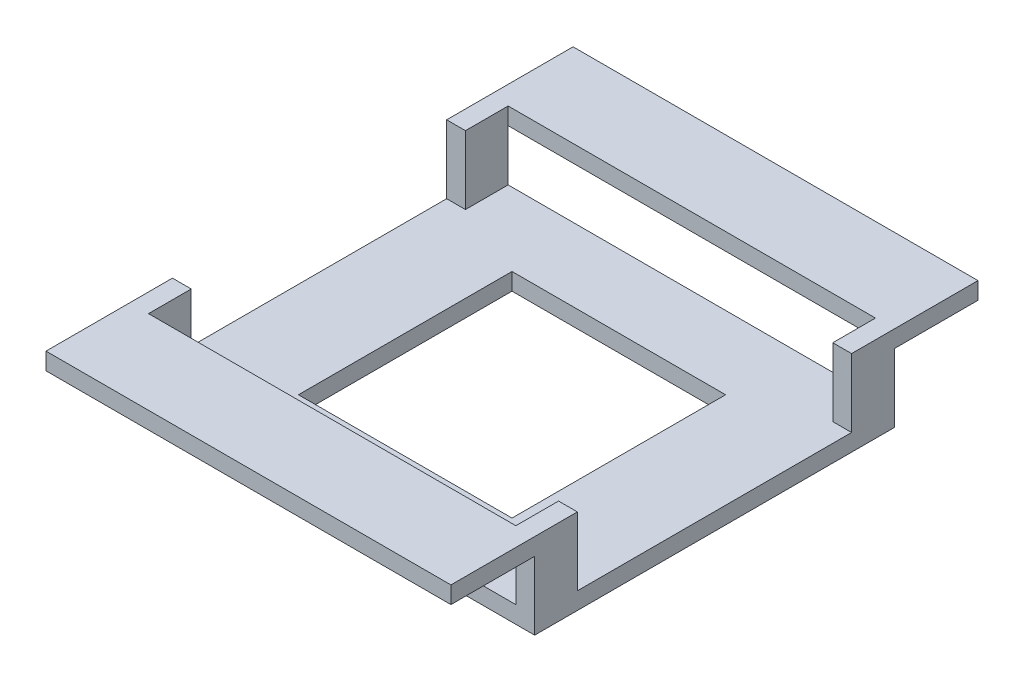
ISO-10303-21;
HEADER;
FILE_DESCRIPTION(('STEP AP214'),'2;1');
FILE_NAME('part.step','',(''),(''),'','','');
FILE_SCHEMA(('AUTOMOTIVE_DESIGN { 1 0 10303 214 1 1 1 1 }'));
ENDSEC;
DATA;
#1=APPLICATION_CONTEXT('core data for automotive mechanical design processes');
#2=APPLICATION_PROTOCOL_DEFINITION('international standard','automotive_design',2000,#1);
#3=PRODUCT_CONTEXT('',#1,'mechanical');
#4=PRODUCT('Part','Part','',(#3));
#5=PRODUCT_RELATED_PRODUCT_CATEGORY('part','',(#4));
#6=PRODUCT_DEFINITION_FORMATION('','',#4);
#7=PRODUCT_DEFINITION_CONTEXT('part definition',#1,'design');
#8=PRODUCT_DEFINITION('design','',#6,#7);
#9=PRODUCT_DEFINITION_SHAPE('','',#8);
#10=(LENGTH_UNIT() NAMED_UNIT(*) SI_UNIT(.MILLI.,.METRE.));
#11=(NAMED_UNIT(*) PLANE_ANGLE_UNIT() SI_UNIT($,.RADIAN.));
#12=(NAMED_UNIT(*) SI_UNIT($,.STERADIAN.) SOLID_ANGLE_UNIT());
#13=UNCERTAINTY_MEASURE_WITH_UNIT(LENGTH_MEASURE(1.E-05),#10,'distance_accuracy_value','');
#14=(GEOMETRIC_REPRESENTATION_CONTEXT(3) GLOBAL_UNCERTAINTY_ASSIGNED_CONTEXT((#13)) GLOBAL_UNIT_ASSIGNED_CONTEXT((#10,
#11,#12)) REPRESENTATION_CONTEXT('',''));
#15=CARTESIAN_POINT('',(0.,0.,0.));
#16=DIRECTION('',(0.,0.,1.));
#17=DIRECTION('',(1.,0.,0.));
#18=AXIS2_PLACEMENT_3D('',#15,#16,#17);
#19=CARTESIAN_POINT('',(-23.7,2.,21.05));
#20=DIRECTION('',(0.,0.,-1.));
#21=DIRECTION('',(-1.,0.,0.));
#22=AXIS2_PLACEMENT_3D('',#19,#20,#21);
#23=PLANE('',#22);
#24=DIRECTION('',(1.,0.,0.));
#25=VECTOR('',#24,1.);
#26=CARTESIAN_POINT('',(21.5,8.,21.05));
#27=LINE('',#26,#25);
#28=CARTESIAN_POINT('',(21.5,8.,21.05));
#29=VERTEX_POINT('',#28);
#30=CARTESIAN_POINT('',(23.7,8.,21.05));
#31=VERTEX_POINT('',#30);
#32=EDGE_CURVE('E271',#29,#31,#27,.T.);
#33=ORIENTED_EDGE('',*,*,#32,.F.);
#34=DIRECTION('',(0.,-1.,0.));
#35=VECTOR('',#34,1.);
#36=CARTESIAN_POINT('',(21.5,10.,21.05));
#37=LINE('',#36,#35);
#38=CARTESIAN_POINT('',(21.5,2.,21.05));
#39=VERTEX_POINT('',#38);
#40=EDGE_CURVE('E305',#29,#39,#37,.T.);
#41=ORIENTED_EDGE('',*,*,#40,.T.);
#42=DIRECTION('',(1.,0.,0.));
#43=VECTOR('',#42,1.);
#44=CARTESIAN_POINT('',(-23.7,2.,21.05));
#45=LINE('',#44,#43);
#46=CARTESIAN_POINT('',(-21.5,2.,21.05));
#47=VERTEX_POINT('',#46);
#48=EDGE_CURVE('E483',#47,#39,#45,.T.);
#49=ORIENTED_EDGE('',*,*,#48,.F.);
#50=DIRECTION('',(0.,-1.,0.));
#51=VECTOR('',#50,1.);
#52=CARTESIAN_POINT('',(-21.5,10.,21.05));
#53=LINE('',#52,#51);
#54=CARTESIAN_POINT('',(-21.5,8.,21.05));
#55=VERTEX_POINT('',#54);
#56=EDGE_CURVE('E366',#55,#47,#53,.T.);
#57=ORIENTED_EDGE('',*,*,#56,.F.);
#58=DIRECTION('',(-1.,0.,0.));
#59=VECTOR('',#58,1.);
#60=CARTESIAN_POINT('',(-21.5,8.,21.05));
#61=LINE('',#60,#59);
#62=CARTESIAN_POINT('',(-23.7,8.,21.05));
#63=VERTEX_POINT('',#62);
#64=EDGE_CURVE('E322',#55,#63,#61,.T.);
#65=ORIENTED_EDGE('',*,*,#64,.T.);
#66=DIRECTION('',(0.,-1.,0.));
#67=VECTOR('',#66,1.);
#68=CARTESIAN_POINT('',(-23.7,2.,21.05));
#69=LINE('',#68,#67);
#70=CARTESIAN_POINT('',(-23.7,0.,21.05));
#71=VERTEX_POINT('',#70);
#72=EDGE_CURVE('E504',#63,#71,#69,.T.);
#73=ORIENTED_EDGE('',*,*,#72,.T.);
#74=DIRECTION('',(1.,0.,0.));
#75=VECTOR('',#74,1.);
#76=CARTESIAN_POINT('',(-23.7,0.,21.05));
#77=LINE('',#76,#75);
#78=CARTESIAN_POINT('',(23.7,0.,21.05));
#79=VERTEX_POINT('',#78);
#80=EDGE_CURVE('E477',#71,#79,#77,.T.);
#81=ORIENTED_EDGE('',*,*,#80,.T.);
#82=DIRECTION('',(0.,-1.,0.));
#83=VECTOR('',#82,1.);
#84=CARTESIAN_POINT('',(23.7,2.,21.05));
#85=LINE('',#84,#83);
#86=EDGE_CURVE('E487',#31,#79,#85,.T.);
#87=ORIENTED_EDGE('',*,*,#86,.F.);
#88=EDGE_LOOP('',(#33,#41,#49,#57,#65,#73,#81,#87));
#89=FACE_BOUND('',#88,.T.);
#90=ADVANCED_FACE('F45',(#89),#23,.F.);
#91=CARTESIAN_POINT('',(0.,2.,0.));
#92=DIRECTION('',(0.,-1.,0.));
#93=DIRECTION('',(0.,0.,-1.));
#94=AXIS2_PLACEMENT_3D('',#91,#92,#93);
#95=PLANE('',#94);
#96=DIRECTION('',(1.,0.,0.));
#97=VECTOR('',#96,1.);
#98=CARTESIAN_POINT('',(-12.5,2.,-12.5));
#99=LINE('',#98,#97);
#100=CARTESIAN_POINT('',(-12.5,2.,-12.5));
#101=VERTEX_POINT('',#100);
#102=CARTESIAN_POINT('',(12.5,2.,-12.5));
#103=VERTEX_POINT('',#102);
#104=EDGE_CURVE('E227',#101,#103,#99,.T.);
#105=ORIENTED_EDGE('',*,*,#104,.T.);
#106=DIRECTION('',(0.,0.,1.));
#107=VECTOR('',#106,1.);
#108=CARTESIAN_POINT('',(12.5,2.,12.5));
#109=LINE('',#108,#107);
#110=CARTESIAN_POINT('',(12.5,2.,12.5));
#111=VERTEX_POINT('',#110);
#112=EDGE_CURVE('E220',#103,#111,#109,.T.);
#113=ORIENTED_EDGE('',*,*,#112,.T.);
#114=DIRECTION('',(-1.,0.,0.));
#115=VECTOR('',#114,1.);
#116=CARTESIAN_POINT('',(-12.5,2.,12.5));
#117=LINE('',#116,#115);
#118=CARTESIAN_POINT('',(-12.5,2.,12.5));
#119=VERTEX_POINT('',#118);
#120=EDGE_CURVE('E230',#111,#119,#117,.T.);
#121=ORIENTED_EDGE('',*,*,#120,.T.);
#122=DIRECTION('',(0.,0.,-1.));
#123=VECTOR('',#122,1.);
#124=CARTESIAN_POINT('',(-12.5,2.,12.5));
#125=LINE('',#124,#123);
#126=EDGE_CURVE('E61',#119,#101,#125,.T.);
#127=ORIENTED_EDGE('',*,*,#126,.T.);
#128=EDGE_LOOP('',(#105,#113,#121,#127));
#129=FACE_BOUND('',#128,.T.);
#130=DIRECTION('',(-1.,0.,0.));
#131=VECTOR('',#130,1.);
#132=CARTESIAN_POINT('',(23.7,2.,16.05));
#133=LINE('',#132,#131);
#134=CARTESIAN_POINT('',(23.7,2.,16.05));
#135=VERTEX_POINT('',#134);
#136=CARTESIAN_POINT('',(21.5,2.,16.05));
#137=VERTEX_POINT('',#136);
#138=EDGE_CURVE('E292',#135,#137,#133,.T.);
#139=ORIENTED_EDGE('',*,*,#138,.F.);
#140=DIRECTION('',(0.,0.,-1.));
#141=VECTOR('',#140,1.);
#142=CARTESIAN_POINT('',(23.7,2.,21.05));
#143=LINE('',#142,#141);
#144=CARTESIAN_POINT('',(23.7,2.,-16.05));
#145=VERTEX_POINT('',#144);
#146=EDGE_CURVE('E473',#135,#145,#143,.T.);
#147=ORIENTED_EDGE('',*,*,#146,.T.);
#148=DIRECTION('',(-1.,0.,0.));
#149=VECTOR('',#148,1.);
#150=CARTESIAN_POINT('',(23.7,2.,-16.05));
#151=LINE('',#150,#149);
#152=CARTESIAN_POINT('',(21.5,2.,-16.05));
#153=VERTEX_POINT('',#152);
#154=EDGE_CURVE('E400',#145,#153,#151,.T.);
#155=ORIENTED_EDGE('',*,*,#154,.T.);
#156=DIRECTION('',(0.,0.,-1.));
#157=VECTOR('',#156,1.);
#158=CARTESIAN_POINT('',(21.5,2.,-21.05));
#159=LINE('',#158,#157);
#160=CARTESIAN_POINT('',(21.5,2.,-21.05));
#161=VERTEX_POINT('',#160);
#162=EDGE_CURVE('E394',#153,#161,#159,.T.);
#163=ORIENTED_EDGE('',*,*,#162,.T.);
#164=DIRECTION('',(-1.,0.,0.));
#165=VECTOR('',#164,1.);
#166=CARTESIAN_POINT('',(-23.7,2.,-21.05));
#167=LINE('',#166,#165);
#168=CARTESIAN_POINT('',(-21.5,2.,-21.05));
#169=VERTEX_POINT('',#168);
#170=EDGE_CURVE('E476',#161,#169,#167,.T.);
#171=ORIENTED_EDGE('',*,*,#170,.T.);
#172=DIRECTION('',(0.,0.,-1.));
#173=VECTOR('',#172,1.);
#174=CARTESIAN_POINT('',(-21.5,2.,-21.05));
#175=LINE('',#174,#173);
#176=CARTESIAN_POINT('',(-21.5,2.,-16.05));
#177=VERTEX_POINT('',#176);
#178=EDGE_CURVE('E447',#177,#169,#175,.T.);
#179=ORIENTED_EDGE('',*,*,#178,.F.);
#180=DIRECTION('',(1.,0.,0.));
#181=VECTOR('',#180,1.);
#182=CARTESIAN_POINT('',(-23.7,2.,-16.05));
#183=LINE('',#182,#181);
#184=CARTESIAN_POINT('',(-23.7,2.,-16.05));
#185=VERTEX_POINT('',#184);
#186=EDGE_CURVE('E441',#185,#177,#183,.T.);
#187=ORIENTED_EDGE('',*,*,#186,.F.);
#188=DIRECTION('',(0.,0.,1.));
#189=VECTOR('',#188,1.);
#190=CARTESIAN_POINT('',(-23.7,2.,21.05));
#191=LINE('',#190,#189);
#192=CARTESIAN_POINT('',(-23.7,2.,16.05));
#193=VERTEX_POINT('',#192);
#194=EDGE_CURVE('E480',#185,#193,#191,.T.);
#195=ORIENTED_EDGE('',*,*,#194,.T.);
#196=DIRECTION('',(1.,0.,0.));
#197=VECTOR('',#196,1.);
#198=CARTESIAN_POINT('',(-23.7,2.,16.05));
#199=LINE('',#198,#197);
#200=CARTESIAN_POINT('',(-21.5,2.,16.05));
#201=VERTEX_POINT('',#200);
#202=EDGE_CURVE('E346',#193,#201,#199,.T.);
#203=ORIENTED_EDGE('',*,*,#202,.T.);
#204=DIRECTION('',(0.,0.,1.));
#205=VECTOR('',#204,1.);
#206=CARTESIAN_POINT('',(-21.5,2.,21.05));
#207=LINE('',#206,#205);
#208=EDGE_CURVE('E340',#201,#47,#207,.T.);
#209=ORIENTED_EDGE('',*,*,#208,.T.);
#210=ORIENTED_EDGE('',*,*,#48,.T.);
#211=DIRECTION('',(0.,0.,1.));
#212=VECTOR('',#211,1.);
#213=CARTESIAN_POINT('',(21.5,2.,21.05));
#214=LINE('',#213,#212);
#215=EDGE_CURVE('E298',#137,#39,#214,.T.);
#216=ORIENTED_EDGE('',*,*,#215,.F.);
#217=EDGE_LOOP('',(#139,#147,#155,#163,#171,#179,#187,#195,#203,#209,#210,#216));
#218=FACE_BOUND('',#217,.T.);
#219=ADVANCED_FACE('F235',(#129,#218),#95,.F.);
#220=CARTESIAN_POINT('',(-21.5,10.,-21.05));
#221=DIRECTION('',(-1.,0.,0.));
#222=DIRECTION('',(0.,0.,1.));
#223=AXIS2_PLACEMENT_3D('',#220,#221,#222);
#224=PLANE('',#223);
#225=DIRECTION('',(0.,-1.,0.));
#226=VECTOR('',#225,1.);
#227=CARTESIAN_POINT('',(-21.5,8.,-21.05));
#228=LINE('',#227,#226);
#229=CARTESIAN_POINT('',(-21.5,10.,-21.05));
#230=VERTEX_POINT('',#229);
#231=CARTESIAN_POINT('',(-21.5,8.,-21.05));
#232=VERTEX_POINT('',#231);
#233=EDGE_CURVE('E369',#230,#232,#228,.T.);
#234=ORIENTED_EDGE('',*,*,#233,.F.);
#235=DIRECTION('',(0.,0.,-1.));
#236=VECTOR('',#235,1.);
#237=CARTESIAN_POINT('',(-21.5,10.,-21.05));
#238=LINE('',#237,#236);
#239=CARTESIAN_POINT('',(-21.5,10.,-16.05));
#240=VERTEX_POINT('',#239);
#241=EDGE_CURVE('E450',#240,#230,#238,.T.);
#242=ORIENTED_EDGE('',*,*,#241,.F.);
#243=DIRECTION('',(0.,-1.,0.));
#244=VECTOR('',#243,1.);
#245=CARTESIAN_POINT('',(-21.5,10.,-16.05));
#246=LINE('',#245,#244);
#247=EDGE_CURVE('E464',#240,#177,#246,.T.);
#248=ORIENTED_EDGE('',*,*,#247,.T.);
#249=ORIENTED_EDGE('',*,*,#178,.T.);
#250=DIRECTION('',(0.,-1.,0.));
#251=VECTOR('',#250,1.);
#252=CARTESIAN_POINT('',(-21.5,10.,-21.05));
#253=LINE('',#252,#251);
#254=EDGE_CURVE('E454',#232,#169,#253,.T.);
#255=ORIENTED_EDGE('',*,*,#254,.F.);
#256=EDGE_LOOP('',(#234,#242,#248,#249,#255));
#257=FACE_BOUND('',#256,.T.);
#258=ADVANCED_FACE('F558',(#257),#224,.F.);
#259=CARTESIAN_POINT('',(21.5,10.,-21.05));
#260=DIRECTION('',(-1.,0.,0.));
#261=DIRECTION('',(0.,0.,1.));
#262=AXIS2_PLACEMENT_3D('',#259,#260,#261);
#263=PLANE('',#262);
#264=DIRECTION('',(0.,0.,-1.));
#265=VECTOR('',#264,1.);
#266=CARTESIAN_POINT('',(21.5,10.,-21.05));
#267=LINE('',#266,#265);
#268=CARTESIAN_POINT('',(21.5,10.,-16.05));
#269=VERTEX_POINT('',#268);
#270=CARTESIAN_POINT('',(21.5,10.,-21.05));
#271=VERTEX_POINT('',#270);
#272=EDGE_CURVE('E399',#269,#271,#267,.T.);
#273=ORIENTED_EDGE('',*,*,#272,.T.);
#274=DIRECTION('',(0.,1.,0.));
#275=VECTOR('',#274,1.);
#276=CARTESIAN_POINT('',(21.5,8.,-21.05));
#277=LINE('',#276,#275);
#278=CARTESIAN_POINT('',(21.5,8.,-21.05));
#279=VERTEX_POINT('',#278);
#280=EDGE_CURVE('E370',#279,#271,#277,.T.);
#281=ORIENTED_EDGE('',*,*,#280,.F.);
#282=DIRECTION('',(0.,-1.,0.));
#283=VECTOR('',#282,1.);
#284=CARTESIAN_POINT('',(21.5,10.,-21.05));
#285=LINE('',#284,#283);
#286=EDGE_CURVE('E420',#279,#161,#285,.T.);
#287=ORIENTED_EDGE('',*,*,#286,.T.);
#288=ORIENTED_EDGE('',*,*,#162,.F.);
#289=DIRECTION('',(0.,-1.,0.));
#290=VECTOR('',#289,1.);
#291=CARTESIAN_POINT('',(21.5,10.,-16.05));
#292=LINE('',#291,#290);
#293=EDGE_CURVE('E416',#269,#153,#292,.T.);
#294=ORIENTED_EDGE('',*,*,#293,.F.);
#295=EDGE_LOOP('',(#273,#281,#287,#288,#294));
#296=FACE_BOUND('',#295,.T.);
#297=ADVANCED_FACE('F578',(#296),#263,.T.);
#298=CARTESIAN_POINT('',(-23.7,2.,-21.05));
#299=DIRECTION('',(0.,0.,1.));
#300=DIRECTION('',(1.,0.,0.));
#301=AXIS2_PLACEMENT_3D('',#298,#299,#300);
#302=PLANE('',#301);
#303=ORIENTED_EDGE('',*,*,#286,.F.);
#304=DIRECTION('',(1.,0.,0.));
#305=VECTOR('',#304,1.);
#306=CARTESIAN_POINT('',(21.5,8.,-21.05));
#307=LINE('',#306,#305);
#308=CARTESIAN_POINT('',(23.7,8.,-21.05));
#309=VERTEX_POINT('',#308);
#310=EDGE_CURVE('E374',#279,#309,#307,.T.);
#311=ORIENTED_EDGE('',*,*,#310,.T.);
#312=DIRECTION('',(0.,-1.,0.));
#313=VECTOR('',#312,1.);
#314=CARTESIAN_POINT('',(23.7,2.,-21.05));
#315=LINE('',#314,#313);
#316=CARTESIAN_POINT('',(23.7,0.,-21.05));
#317=VERTEX_POINT('',#316);
#318=EDGE_CURVE('E11',#309,#317,#315,.T.);
#319=ORIENTED_EDGE('',*,*,#318,.T.);
#320=DIRECTION('',(-1.,0.,0.));
#321=VECTOR('',#320,1.);
#322=CARTESIAN_POINT('',(-23.7,0.,-21.05));
#323=LINE('',#322,#321);
#324=CARTESIAN_POINT('',(-23.7,0.,-21.05));
#325=VERTEX_POINT('',#324);
#326=EDGE_CURVE('E491',#317,#325,#323,.T.);
#327=ORIENTED_EDGE('',*,*,#326,.T.);
#328=DIRECTION('',(0.,-1.,0.));
#329=VECTOR('',#328,1.);
#330=CARTESIAN_POINT('',(-23.7,2.,-21.05));
#331=LINE('',#330,#329);
#332=CARTESIAN_POINT('',(-23.7,8.,-21.05));
#333=VERTEX_POINT('',#332);
#334=EDGE_CURVE('E54',#333,#325,#331,.T.);
#335=ORIENTED_EDGE('',*,*,#334,.F.);
#336=DIRECTION('',(-1.,0.,0.));
#337=VECTOR('',#336,1.);
#338=CARTESIAN_POINT('',(-21.5,8.,-21.05));
#339=LINE('',#338,#337);
#340=EDGE_CURVE('E423',#232,#333,#339,.T.);
#341=ORIENTED_EDGE('',*,*,#340,.F.);
#342=ORIENTED_EDGE('',*,*,#254,.T.);
#343=ORIENTED_EDGE('',*,*,#170,.F.);
#344=EDGE_LOOP('',(#303,#311,#319,#327,#335,#341,#342,#343));
#345=FACE_BOUND('',#344,.T.);
#346=ADVANCED_FACE('F518',(#345),#302,.F.);
#347=CARTESIAN_POINT('',(23.7,2.,21.05));
#348=DIRECTION('',(-1.,0.,0.));
#349=DIRECTION('',(0.,0.,1.));
#350=AXIS2_PLACEMENT_3D('',#347,#348,#349);
#351=PLANE('',#350);
#352=DIRECTION('',(0.,0.,-1.));
#353=VECTOR('',#352,1.);
#354=CARTESIAN_POINT('',(23.7,0.,21.05));
#355=LINE('',#354,#353);
#356=EDGE_CURVE('E472',#79,#317,#355,.T.);
#357=ORIENTED_EDGE('',*,*,#356,.T.);
#358=ORIENTED_EDGE('',*,*,#318,.F.);
#359=DIRECTION('',(0.,0.,1.));
#360=VECTOR('',#359,1.);
#361=CARTESIAN_POINT('',(23.7,8.,-30.85));
#362=LINE('',#361,#360);
#363=CARTESIAN_POINT('',(23.7,8.,-30.85));
#364=VERTEX_POINT('',#363);
#365=EDGE_CURVE('E388',#364,#309,#362,.T.);
#366=ORIENTED_EDGE('',*,*,#365,.F.);
#367=DIRECTION('',(0.,1.,0.));
#368=VECTOR('',#367,1.);
#369=CARTESIAN_POINT('',(23.7,10.,-30.85));
#370=LINE('',#369,#368);
#371=CARTESIAN_POINT('',(23.7,10.,-30.85));
#372=VERTEX_POINT('',#371);
#373=EDGE_CURVE('E384',#364,#372,#370,.T.);
#374=ORIENTED_EDGE('',*,*,#373,.T.);
#375=DIRECTION('',(0.,0.,1.));
#376=VECTOR('',#375,1.);
#377=CARTESIAN_POINT('',(23.7,10.,-21.05));
#378=LINE('',#377,#376);
#379=CARTESIAN_POINT('',(23.7,10.,-16.05));
#380=VERTEX_POINT('',#379);
#381=EDGE_CURVE('E395',#372,#380,#378,.T.);
#382=ORIENTED_EDGE('',*,*,#381,.T.);
#383=DIRECTION('',(0.,-1.,0.));
#384=VECTOR('',#383,1.);
#385=CARTESIAN_POINT('',(23.7,10.,-16.05));
#386=LINE('',#385,#384);
#387=EDGE_CURVE('E407',#380,#145,#386,.T.);
#388=ORIENTED_EDGE('',*,*,#387,.T.);
#389=ORIENTED_EDGE('',*,*,#146,.F.);
#390=DIRECTION('',(0.,-1.,0.));
#391=VECTOR('',#390,1.);
#392=CARTESIAN_POINT('',(23.7,10.,16.05));
#393=LINE('',#392,#391);
#394=CARTESIAN_POINT('',(23.7,10.,16.05));
#395=VERTEX_POINT('',#394);
#396=EDGE_CURVE('E318',#395,#135,#393,.T.);
#397=ORIENTED_EDGE('',*,*,#396,.F.);
#398=DIRECTION('',(0.,0.,-1.));
#399=VECTOR('',#398,1.);
#400=CARTESIAN_POINT('',(23.7,10.,21.05));
#401=LINE('',#400,#399);
#402=CARTESIAN_POINT('',(23.7,10.,30.85));
#403=VERTEX_POINT('',#402);
#404=EDGE_CURVE('E293',#403,#395,#401,.T.);
#405=ORIENTED_EDGE('',*,*,#404,.F.);
#406=DIRECTION('',(0.,1.,0.));
#407=VECTOR('',#406,1.);
#408=CARTESIAN_POINT('',(23.7,10.,30.85));
#409=LINE('',#408,#407);
#410=CARTESIAN_POINT('',(23.7,8.,30.85));
#411=VERTEX_POINT('',#410);
#412=EDGE_CURVE('E282',#411,#403,#409,.T.);
#413=ORIENTED_EDGE('',*,*,#412,.F.);
#414=DIRECTION('',(0.,0.,-1.));
#415=VECTOR('',#414,1.);
#416=CARTESIAN_POINT('',(23.7,8.,30.85));
#417=LINE('',#416,#415);
#418=EDGE_CURVE('E286',#411,#31,#417,.T.);
#419=ORIENTED_EDGE('',*,*,#418,.T.);
#420=ORIENTED_EDGE('',*,*,#86,.T.);
#421=EDGE_LOOP('',(#357,#358,#366,#374,#382,#388,#389,#397,#405,#413,#419,#420));
#422=FACE_BOUND('',#421,.T.);
#423=ADVANCED_FACE('F47',(#422),#351,.F.);
#424=CARTESIAN_POINT('',(-23.7,2.,21.05));
#425=DIRECTION('',(1.,0.,0.));
#426=DIRECTION('',(0.,0.,-1.));
#427=AXIS2_PLACEMENT_3D('',#424,#425,#426);
#428=PLANE('',#427);
#429=DIRECTION('',(0.,0.,1.));
#430=VECTOR('',#429,1.);
#431=CARTESIAN_POINT('',(-23.7,0.,21.05));
#432=LINE('',#431,#430);
#433=EDGE_CURVE('E495',#325,#71,#432,.T.);
#434=ORIENTED_EDGE('',*,*,#433,.T.);
#435=ORIENTED_EDGE('',*,*,#72,.F.);
#436=DIRECTION('',(0.,0.,-1.));
#437=VECTOR('',#436,1.);
#438=CARTESIAN_POINT('',(-23.7,8.,30.85));
#439=LINE('',#438,#437);
#440=CARTESIAN_POINT('',(-23.7,8.,30.85));
#441=VERTEX_POINT('',#440);
#442=EDGE_CURVE('E334',#441,#63,#439,.T.);
#443=ORIENTED_EDGE('',*,*,#442,.F.);
#444=DIRECTION('',(0.,1.,0.));
#445=VECTOR('',#444,1.);
#446=CARTESIAN_POINT('',(-23.7,10.,30.85));
#447=LINE('',#446,#445);
#448=CARTESIAN_POINT('',(-23.7,10.,30.85));
#449=VERTEX_POINT('',#448);
#450=EDGE_CURVE('E326',#441,#449,#447,.T.);
#451=ORIENTED_EDGE('',*,*,#450,.T.);
#452=DIRECTION('',(0.,0.,-1.));
#453=VECTOR('',#452,1.);
#454=CARTESIAN_POINT('',(-23.7,10.,21.05));
#455=LINE('',#454,#453);
#456=CARTESIAN_POINT('',(-23.7,10.,16.05));
#457=VERTEX_POINT('',#456);
#458=EDGE_CURVE('E341',#449,#457,#455,.T.);
#459=ORIENTED_EDGE('',*,*,#458,.T.);
#460=DIRECTION('',(0.,-1.,0.));
#461=VECTOR('',#460,1.);
#462=CARTESIAN_POINT('',(-23.7,10.,16.05));
#463=LINE('',#462,#461);
#464=EDGE_CURVE('E353',#457,#193,#463,.T.);
#465=ORIENTED_EDGE('',*,*,#464,.T.);
#466=ORIENTED_EDGE('',*,*,#194,.F.);
#467=DIRECTION('',(0.,-1.,0.));
#468=VECTOR('',#467,1.);
#469=CARTESIAN_POINT('',(-23.7,10.,-16.05));
#470=LINE('',#469,#468);
#471=CARTESIAN_POINT('',(-23.7,10.,-16.05));
#472=VERTEX_POINT('',#471);
#473=EDGE_CURVE('E468',#472,#185,#470,.T.);
#474=ORIENTED_EDGE('',*,*,#473,.F.);
#475=DIRECTION('',(0.,0.,1.));
#476=VECTOR('',#475,1.);
#477=CARTESIAN_POINT('',(-23.7,10.,-21.05));
#478=LINE('',#477,#476);
#479=CARTESIAN_POINT('',(-23.7,10.,-30.85));
#480=VERTEX_POINT('',#479);
#481=EDGE_CURVE('E442',#480,#472,#478,.T.);
#482=ORIENTED_EDGE('',*,*,#481,.F.);
#483=DIRECTION('',(0.,1.,0.));
#484=VECTOR('',#483,1.);
#485=CARTESIAN_POINT('',(-23.7,10.,-30.85));
#486=LINE('',#485,#484);
#487=CARTESIAN_POINT('',(-23.7,8.,-30.85));
#488=VERTEX_POINT('',#487);
#489=EDGE_CURVE('E427',#488,#480,#486,.T.);
#490=ORIENTED_EDGE('',*,*,#489,.F.);
#491=DIRECTION('',(0.,0.,1.));
#492=VECTOR('',#491,1.);
#493=CARTESIAN_POINT('',(-23.7,8.,-30.85));
#494=LINE('',#493,#492);
#495=EDGE_CURVE('E434',#488,#333,#494,.T.);
#496=ORIENTED_EDGE('',*,*,#495,.T.);
#497=ORIENTED_EDGE('',*,*,#334,.T.);
#498=EDGE_LOOP('',(#434,#435,#443,#451,#459,#465,#466,#474,#482,#490,#496,#497));
#499=FACE_BOUND('',#498,.T.);
#500=ADVANCED_FACE('F508',(#499),#428,.F.);
#501=CARTESIAN_POINT('',(0.,0.,0.));
#502=DIRECTION('',(0.,-1.,0.));
#503=DIRECTION('',(0.,0.,-1.));
#504=AXIS2_PLACEMENT_3D('',#501,#502,#503);
#505=PLANE('',#504);
#506=DIRECTION('',(0.,0.,1.));
#507=VECTOR('',#506,1.);
#508=CARTESIAN_POINT('',(12.5,0.,12.5));
#509=LINE('',#508,#507);
#510=CARTESIAN_POINT('',(12.5,0.,-12.5));
#511=VERTEX_POINT('',#510);
#512=CARTESIAN_POINT('',(12.5,0.,12.5));
#513=VERTEX_POINT('',#512);
#514=EDGE_CURVE('E69',#511,#513,#509,.T.);
#515=ORIENTED_EDGE('',*,*,#514,.F.);
#516=DIRECTION('',(1.,0.,0.));
#517=VECTOR('',#516,1.);
#518=CARTESIAN_POINT('',(-12.5,0.,-12.5));
#519=LINE('',#518,#517);
#520=CARTESIAN_POINT('',(-12.5,0.,-12.5));
#521=VERTEX_POINT('',#520);
#522=EDGE_CURVE('E239',#521,#511,#519,.T.);
#523=ORIENTED_EDGE('',*,*,#522,.F.);
#524=DIRECTION('',(0.,0.,-1.));
#525=VECTOR('',#524,1.);
#526=CARTESIAN_POINT('',(-12.5,0.,12.5));
#527=LINE('',#526,#525);
#528=CARTESIAN_POINT('',(-12.5,0.,12.5));
#529=VERTEX_POINT('',#528);
#530=EDGE_CURVE('E243',#529,#521,#527,.T.);
#531=ORIENTED_EDGE('',*,*,#530,.F.);
#532=DIRECTION('',(-1.,0.,0.));
#533=VECTOR('',#532,1.);
#534=CARTESIAN_POINT('',(-12.5,0.,12.5));
#535=LINE('',#534,#533);
#536=EDGE_CURVE('E252',#513,#529,#535,.T.);
#537=ORIENTED_EDGE('',*,*,#536,.F.);
#538=EDGE_LOOP('',(#515,#523,#531,#537));
#539=FACE_BOUND('',#538,.T.);
#540=ORIENTED_EDGE('',*,*,#356,.F.);
#541=ORIENTED_EDGE('',*,*,#80,.F.);
#542=ORIENTED_EDGE('',*,*,#433,.F.);
#543=ORIENTED_EDGE('',*,*,#326,.F.);
#544=EDGE_LOOP('',(#540,#541,#542,#543));
#545=FACE_BOUND('',#544,.T.);
#546=ADVANCED_FACE('F522',(#539,#545),#505,.T.);
#547=CARTESIAN_POINT('',(-23.7,10.,-16.05));
#548=DIRECTION('',(0.,0.,-1.));
#549=DIRECTION('',(-1.,0.,0.));
#550=AXIS2_PLACEMENT_3D('',#547,#548,#549);
#551=PLANE('',#550);
#552=ORIENTED_EDGE('',*,*,#186,.T.);
#553=ORIENTED_EDGE('',*,*,#247,.F.);
#554=DIRECTION('',(1.,0.,0.));
#555=VECTOR('',#554,1.);
#556=CARTESIAN_POINT('',(-23.7,10.,-16.05));
#557=LINE('',#556,#555);
#558=EDGE_CURVE('E446',#472,#240,#557,.T.);
#559=ORIENTED_EDGE('',*,*,#558,.F.);
#560=ORIENTED_EDGE('',*,*,#473,.T.);
#561=EDGE_LOOP('',(#552,#553,#559,#560));
#562=FACE_BOUND('',#561,.T.);
#563=ADVANCED_FACE('F554',(#562),#551,.F.);
#564=CARTESIAN_POINT('',(0.,10.,0.));
#565=DIRECTION('',(0.,1.,0.));
#566=DIRECTION('',(0.,0.,1.));
#567=AXIS2_PLACEMENT_3D('',#564,#565,#566);
#568=PLANE('',#567);
#569=ORIENTED_EDGE('',*,*,#481,.T.);
#570=ORIENTED_EDGE('',*,*,#558,.T.);
#571=ORIENTED_EDGE('',*,*,#241,.T.);
#572=DIRECTION('',(-1.,0.,0.));
#573=VECTOR('',#572,1.);
#574=CARTESIAN_POINT('',(31.50199980004,10.,-21.05));
#575=LINE('',#574,#573);
#576=EDGE_CURVE('E379',#271,#230,#575,.T.);
#577=ORIENTED_EDGE('',*,*,#576,.F.);
#578=ORIENTED_EDGE('',*,*,#272,.F.);
#579=DIRECTION('',(-1.,0.,0.));
#580=VECTOR('',#579,1.);
#581=CARTESIAN_POINT('',(23.7,10.,-16.05));
#582=LINE('',#581,#580);
#583=EDGE_CURVE('E403',#380,#269,#582,.T.);
#584=ORIENTED_EDGE('',*,*,#583,.F.);
#585=ORIENTED_EDGE('',*,*,#381,.F.);
#586=DIRECTION('',(1.,0.,0.));
#587=VECTOR('',#586,1.);
#588=CARTESIAN_POINT('',(-21.5,10.,-30.85));
#589=LINE('',#588,#587);
#590=EDGE_CURVE('E431',#480,#372,#589,.T.);
#591=ORIENTED_EDGE('',*,*,#590,.F.);
#592=EDGE_LOOP('',(#569,#570,#571,#577,#578,#584,#585,#591));
#593=FACE_BOUND('',#592,.T.);
#594=ADVANCED_FACE('F562',(#593),#568,.T.);
#595=CARTESIAN_POINT('',(-21.5,8.,-30.85));
#596=DIRECTION('',(0.,1.,0.));
#597=DIRECTION('',(0.,0.,1.));
#598=AXIS2_PLACEMENT_3D('',#595,#596,#597);
#599=PLANE('',#598);
#600=ORIENTED_EDGE('',*,*,#340,.T.);
#601=ORIENTED_EDGE('',*,*,#495,.F.);
#602=DIRECTION('',(-1.,0.,0.));
#603=VECTOR('',#602,1.);
#604=CARTESIAN_POINT('',(-21.5,8.,-30.85));
#605=LINE('',#604,#603);
#606=EDGE_CURVE('E424',#364,#488,#605,.T.);
#607=ORIENTED_EDGE('',*,*,#606,.F.);
#608=ORIENTED_EDGE('',*,*,#365,.T.);
#609=ORIENTED_EDGE('',*,*,#310,.F.);
#610=DIRECTION('',(-1.,0.,0.));
#611=VECTOR('',#610,1.);
#612=CARTESIAN_POINT('',(31.50199980004,8.,-21.05));
#613=LINE('',#612,#611);
#614=EDGE_CURVE('E375',#279,#232,#613,.T.);
#615=ORIENTED_EDGE('',*,*,#614,.T.);
#616=EDGE_LOOP('',(#600,#601,#607,#608,#609,#615));
#617=FACE_BOUND('',#616,.T.);
#618=ADVANCED_FACE('F571',(#617),#599,.F.);
#619=CARTESIAN_POINT('',(0.,0.,-30.85));
#620=DIRECTION('',(0.,0.,-1.));
#621=DIRECTION('',(-1.,0.,0.));
#622=AXIS2_PLACEMENT_3D('',#619,#620,#621);
#623=PLANE('',#622);
#624=ORIENTED_EDGE('',*,*,#590,.T.);
#625=ORIENTED_EDGE('',*,*,#373,.F.);
#626=ORIENTED_EDGE('',*,*,#606,.T.);
#627=ORIENTED_EDGE('',*,*,#489,.T.);
#628=EDGE_LOOP('',(#624,#625,#626,#627));
#629=FACE_BOUND('',#628,.T.);
#630=ADVANCED_FACE('F567',(#629),#623,.T.);
#631=CARTESIAN_POINT('',(23.7,10.,-16.05));
#632=DIRECTION('',(0.,0.,1.));
#633=DIRECTION('',(1.,0.,0.));
#634=AXIS2_PLACEMENT_3D('',#631,#632,#633);
#635=PLANE('',#634);
#636=ORIENTED_EDGE('',*,*,#154,.F.);
#637=ORIENTED_EDGE('',*,*,#387,.F.);
#638=ORIENTED_EDGE('',*,*,#583,.T.);
#639=ORIENTED_EDGE('',*,*,#293,.T.);
#640=EDGE_LOOP('',(#636,#637,#638,#639));
#641=FACE_BOUND('',#640,.T.);
#642=ADVANCED_FACE('F583',(#641),#635,.T.);
#643=CARTESIAN_POINT('',(31.50199980004,8.,-21.05));
#644=DIRECTION('',(0.,0.,-1.));
#645=DIRECTION('',(-1.,0.,0.));
#646=AXIS2_PLACEMENT_3D('',#643,#644,#645);
#647=PLANE('',#646);
#648=ORIENTED_EDGE('',*,*,#614,.F.);
#649=ORIENTED_EDGE('',*,*,#280,.T.);
#650=ORIENTED_EDGE('',*,*,#576,.T.);
#651=ORIENTED_EDGE('',*,*,#233,.T.);
#652=EDGE_LOOP('',(#648,#649,#650,#651));
#653=FACE_BOUND('',#652,.T.);
#654=ADVANCED_FACE('F580',(#653),#647,.F.);
#655=CARTESIAN_POINT('',(-21.5,10.,21.05));
#656=DIRECTION('',(1.,0.,0.));
#657=DIRECTION('',(0.,0.,-1.));
#658=AXIS2_PLACEMENT_3D('',#655,#656,#657);
#659=PLANE('',#658);
#660=DIRECTION('',(0.,-1.,0.));
#661=VECTOR('',#660,1.);
#662=CARTESIAN_POINT('',(-21.5,8.,21.05));
#663=LINE('',#662,#661);
#664=CARTESIAN_POINT('',(-21.5,10.,21.05));
#665=VERTEX_POINT('',#664);
#666=EDGE_CURVE('E261',#665,#55,#663,.T.);
#667=ORIENTED_EDGE('',*,*,#666,.T.);
#668=ORIENTED_EDGE('',*,*,#56,.T.);
#669=ORIENTED_EDGE('',*,*,#208,.F.);
#670=DIRECTION('',(0.,-1.,0.));
#671=VECTOR('',#670,1.);
#672=CARTESIAN_POINT('',(-21.5,10.,16.05));
#673=LINE('',#672,#671);
#674=CARTESIAN_POINT('',(-21.5,10.,16.05));
#675=VERTEX_POINT('',#674);
#676=EDGE_CURVE('E362',#675,#201,#673,.T.);
#677=ORIENTED_EDGE('',*,*,#676,.F.);
#678=DIRECTION('',(0.,0.,1.));
#679=VECTOR('',#678,1.);
#680=CARTESIAN_POINT('',(-21.5,10.,21.05));
#681=LINE('',#680,#679);
#682=EDGE_CURVE('E345',#675,#665,#681,.T.);
#683=ORIENTED_EDGE('',*,*,#682,.T.);
#684=EDGE_LOOP('',(#667,#668,#669,#677,#683));
#685=FACE_BOUND('',#684,.T.);
#686=ADVANCED_FACE('F582',(#685),#659,.T.);
#687=CARTESIAN_POINT('',(-23.7,10.,16.05));
#688=DIRECTION('',(0.,0.,-1.));
#689=DIRECTION('',(-1.,0.,0.));
#690=AXIS2_PLACEMENT_3D('',#687,#688,#689);
#691=PLANE('',#690);
#692=ORIENTED_EDGE('',*,*,#202,.F.);
#693=ORIENTED_EDGE('',*,*,#464,.F.);
#694=DIRECTION('',(1.,0.,0.));
#695=VECTOR('',#694,1.);
#696=CARTESIAN_POINT('',(-23.7,10.,16.05));
#697=LINE('',#696,#695);
#698=EDGE_CURVE('E349',#457,#675,#697,.T.);
#699=ORIENTED_EDGE('',*,*,#698,.T.);
#700=ORIENTED_EDGE('',*,*,#676,.T.);
#701=EDGE_LOOP('',(#692,#693,#699,#700));
#702=FACE_BOUND('',#701,.T.);
#703=ADVANCED_FACE('F550',(#702),#691,.T.);
#704=CARTESIAN_POINT('',(0.,10.,0.));
#705=DIRECTION('',(0.,1.,0.));
#706=DIRECTION('',(0.,0.,-1.));
#707=AXIS2_PLACEMENT_3D('',#704,#705,#706);
#708=PLANE('',#707);
#709=ORIENTED_EDGE('',*,*,#458,.F.);
#710=DIRECTION('',(1.,0.,0.));
#711=VECTOR('',#710,1.);
#712=CARTESIAN_POINT('',(-21.5,10.,30.85));
#713=LINE('',#712,#711);
#714=EDGE_CURVE('E323',#449,#403,#713,.T.);
#715=ORIENTED_EDGE('',*,*,#714,.T.);
#716=ORIENTED_EDGE('',*,*,#404,.T.);
#717=DIRECTION('',(-1.,0.,0.));
#718=VECTOR('',#717,1.);
#719=CARTESIAN_POINT('',(23.7,10.,16.05));
#720=LINE('',#719,#718);
#721=CARTESIAN_POINT('',(21.5,10.,16.05));
#722=VERTEX_POINT('',#721);
#723=EDGE_CURVE('E297',#395,#722,#720,.T.);
#724=ORIENTED_EDGE('',*,*,#723,.T.);
#725=DIRECTION('',(0.,0.,1.));
#726=VECTOR('',#725,1.);
#727=CARTESIAN_POINT('',(21.5,10.,21.05));
#728=LINE('',#727,#726);
#729=CARTESIAN_POINT('',(21.5,10.,21.05));
#730=VERTEX_POINT('',#729);
#731=EDGE_CURVE('E301',#722,#730,#728,.T.);
#732=ORIENTED_EDGE('',*,*,#731,.T.);
#733=DIRECTION('',(-1.,0.,0.));
#734=VECTOR('',#733,1.);
#735=CARTESIAN_POINT('',(31.50199980004,10.,21.05));
#736=LINE('',#735,#734);
#737=EDGE_CURVE('E272',#730,#665,#736,.T.);
#738=ORIENTED_EDGE('',*,*,#737,.T.);
#739=ORIENTED_EDGE('',*,*,#682,.F.);
#740=ORIENTED_EDGE('',*,*,#698,.F.);
#741=EDGE_LOOP('',(#709,#715,#716,#724,#732,#738,#739,#740));
#742=FACE_BOUND('',#741,.T.);
#743=ADVANCED_FACE('F542',(#742),#708,.T.);
#744=CARTESIAN_POINT('',(-21.5,8.,30.85));
#745=DIRECTION('',(0.,-1.,0.));
#746=DIRECTION('',(0.,0.,-1.));
#747=AXIS2_PLACEMENT_3D('',#744,#745,#746);
#748=PLANE('',#747);
#749=ORIENTED_EDGE('',*,*,#64,.F.);
#750=DIRECTION('',(-1.,0.,0.));
#751=VECTOR('',#750,1.);
#752=CARTESIAN_POINT('',(31.50199980004,8.,21.05));
#753=LINE('',#752,#751);
#754=EDGE_CURVE('E275',#29,#55,#753,.T.);
#755=ORIENTED_EDGE('',*,*,#754,.F.);
#756=ORIENTED_EDGE('',*,*,#32,.T.);
#757=ORIENTED_EDGE('',*,*,#418,.F.);
#758=DIRECTION('',(-1.,0.,0.));
#759=VECTOR('',#758,1.);
#760=CARTESIAN_POINT('',(-21.5,8.,30.85));
#761=LINE('',#760,#759);
#762=EDGE_CURVE('E330',#411,#441,#761,.T.);
#763=ORIENTED_EDGE('',*,*,#762,.T.);
#764=ORIENTED_EDGE('',*,*,#442,.T.);
#765=EDGE_LOOP('',(#749,#755,#756,#757,#763,#764));
#766=FACE_BOUND('',#765,.T.);
#767=ADVANCED_FACE('F534',(#766),#748,.T.);
#768=CARTESIAN_POINT('',(0.,0.,30.85));
#769=DIRECTION('',(0.,0.,1.));
#770=DIRECTION('',(-1.,0.,0.));
#771=AXIS2_PLACEMENT_3D('',#768,#769,#770);
#772=PLANE('',#771);
#773=ORIENTED_EDGE('',*,*,#762,.F.);
#774=ORIENTED_EDGE('',*,*,#412,.T.);
#775=ORIENTED_EDGE('',*,*,#714,.F.);
#776=ORIENTED_EDGE('',*,*,#450,.F.);
#777=EDGE_LOOP('',(#773,#774,#775,#776));
#778=FACE_BOUND('',#777,.T.);
#779=ADVANCED_FACE('F532',(#778),#772,.T.);
#780=CARTESIAN_POINT('',(23.7,10.,16.05));
#781=DIRECTION('',(0.,0.,1.));
#782=DIRECTION('',(1.,0.,0.));
#783=AXIS2_PLACEMENT_3D('',#780,#781,#782);
#784=PLANE('',#783);
#785=ORIENTED_EDGE('',*,*,#138,.T.);
#786=DIRECTION('',(0.,-1.,0.));
#787=VECTOR('',#786,1.);
#788=CARTESIAN_POINT('',(21.5,10.,16.05));
#789=LINE('',#788,#787);
#790=EDGE_CURVE('E314',#722,#137,#789,.T.);
#791=ORIENTED_EDGE('',*,*,#790,.F.);
#792=ORIENTED_EDGE('',*,*,#723,.F.);
#793=ORIENTED_EDGE('',*,*,#396,.T.);
#794=EDGE_LOOP('',(#785,#791,#792,#793));
#795=FACE_BOUND('',#794,.T.);
#796=ADVANCED_FACE('F649',(#795),#784,.F.);
#797=CARTESIAN_POINT('',(21.5,10.,21.05));
#798=DIRECTION('',(1.,0.,0.));
#799=DIRECTION('',(0.,0.,-1.));
#800=AXIS2_PLACEMENT_3D('',#797,#798,#799);
#801=PLANE('',#800);
#802=ORIENTED_EDGE('',*,*,#40,.F.);
#803=DIRECTION('',(0.,1.,0.));
#804=VECTOR('',#803,1.);
#805=CARTESIAN_POINT('',(21.5,8.,21.05));
#806=LINE('',#805,#804);
#807=EDGE_CURVE('E267',#29,#730,#806,.T.);
#808=ORIENTED_EDGE('',*,*,#807,.T.);
#809=ORIENTED_EDGE('',*,*,#731,.F.);
#810=ORIENTED_EDGE('',*,*,#790,.T.);
#811=ORIENTED_EDGE('',*,*,#215,.T.);
#812=EDGE_LOOP('',(#802,#808,#809,#810,#811));
#813=FACE_BOUND('',#812,.T.);
#814=ADVANCED_FACE('F645',(#813),#801,.F.);
#815=CARTESIAN_POINT('',(31.50199980004,8.,21.05));
#816=DIRECTION('',(0.,0.,-1.));
#817=DIRECTION('',(-1.,0.,0.));
#818=AXIS2_PLACEMENT_3D('',#815,#816,#817);
#819=PLANE('',#818);
#820=ORIENTED_EDGE('',*,*,#807,.F.);
#821=ORIENTED_EDGE('',*,*,#754,.T.);
#822=ORIENTED_EDGE('',*,*,#666,.F.);
#823=ORIENTED_EDGE('',*,*,#737,.F.);
#824=EDGE_LOOP('',(#820,#821,#822,#823));
#825=FACE_BOUND('',#824,.T.);
#826=ADVANCED_FACE('F638',(#825),#819,.T.);
#827=CARTESIAN_POINT('',(12.5,2.,12.5));
#828=DIRECTION('',(1.,0.,0.));
#829=DIRECTION('',(0.,0.,-1.));
#830=AXIS2_PLACEMENT_3D('',#827,#828,#829);
#831=PLANE('',#830);
#832=ORIENTED_EDGE('',*,*,#514,.T.);
#833=DIRECTION('',(0.,-1.,0.));
#834=VECTOR('',#833,1.);
#835=CARTESIAN_POINT('',(12.5,2.,12.5));
#836=LINE('',#835,#834);
#837=EDGE_CURVE('E216',#111,#513,#836,.T.);
#838=ORIENTED_EDGE('',*,*,#837,.F.);
#839=ORIENTED_EDGE('',*,*,#112,.F.);
#840=DIRECTION('',(0.,-1.,0.));
#841=VECTOR('',#840,1.);
#842=CARTESIAN_POINT('',(12.5,2.,-12.5));
#843=LINE('',#842,#841);
#844=EDGE_CURVE('E258',#103,#511,#843,.T.);
#845=ORIENTED_EDGE('',*,*,#844,.T.);
#846=EDGE_LOOP('',(#832,#838,#839,#845));
#847=FACE_BOUND('',#846,.T.);
#848=ADVANCED_FACE('F218',(#847),#831,.F.);
#849=CARTESIAN_POINT('',(-12.5,2.,-12.5));
#850=DIRECTION('',(0.,0.,-1.));
#851=DIRECTION('',(-1.,0.,0.));
#852=AXIS2_PLACEMENT_3D('',#849,#850,#851);
#853=PLANE('',#852);
#854=ORIENTED_EDGE('',*,*,#522,.T.);
#855=ORIENTED_EDGE('',*,*,#844,.F.);
#856=ORIENTED_EDGE('',*,*,#104,.F.);
#857=DIRECTION('',(0.,-1.,0.));
#858=VECTOR('',#857,1.);
#859=CARTESIAN_POINT('',(-12.5,2.,-12.5));
#860=LINE('',#859,#858);
#861=EDGE_CURVE('E262',#101,#521,#860,.T.);
#862=ORIENTED_EDGE('',*,*,#861,.T.);
#863=EDGE_LOOP('',(#854,#855,#856,#862));
#864=FACE_BOUND('',#863,.T.);
#865=ADVANCED_FACE('F631',(#864),#853,.F.);
#866=CARTESIAN_POINT('',(-12.5,2.,12.5));
#867=DIRECTION('',(-1.,0.,0.));
#868=DIRECTION('',(0.,0.,1.));
#869=AXIS2_PLACEMENT_3D('',#866,#867,#868);
#870=PLANE('',#869);
#871=ORIENTED_EDGE('',*,*,#530,.T.);
#872=ORIENTED_EDGE('',*,*,#861,.F.);
#873=ORIENTED_EDGE('',*,*,#126,.F.);
#874=DIRECTION('',(0.,-1.,0.));
#875=VECTOR('',#874,1.);
#876=CARTESIAN_POINT('',(-12.5,2.,12.5));
#877=LINE('',#876,#875);
#878=EDGE_CURVE('E226',#119,#529,#877,.T.);
#879=ORIENTED_EDGE('',*,*,#878,.T.);
#880=EDGE_LOOP('',(#871,#872,#873,#879));
#881=FACE_BOUND('',#880,.T.);
#882=ADVANCED_FACE('F629',(#881),#870,.F.);
#883=CARTESIAN_POINT('',(-12.5,2.,12.5));
#884=DIRECTION('',(0.,0.,1.));
#885=DIRECTION('',(1.,0.,0.));
#886=AXIS2_PLACEMENT_3D('',#883,#884,#885);
#887=PLANE('',#886);
#888=ORIENTED_EDGE('',*,*,#536,.T.);
#889=ORIENTED_EDGE('',*,*,#878,.F.);
#890=ORIENTED_EDGE('',*,*,#120,.F.);
#891=ORIENTED_EDGE('',*,*,#837,.T.);
#892=EDGE_LOOP('',(#888,#889,#890,#891));
#893=FACE_BOUND('',#892,.T.);
#894=ADVANCED_FACE('F231',(#893),#887,.F.);
#895=CLOSED_SHELL('',(#90,#219,#258,#297,#346,#423,#500,#546,#563,#594,#618,#630,#642,#654,#686,
#703,#743,#767,#779,#796,#814,#826,#848,#865,#882,#894));
#896=MANIFOLD_SOLID_BREP('B2',#895);
#897=ADVANCED_BREP_SHAPE_REPRESENTATION('',(#18,#896),#14);
#898=SHAPE_DEFINITION_REPRESENTATION(#9,#897);
ENDSEC;
END-ISO-10303-21;
